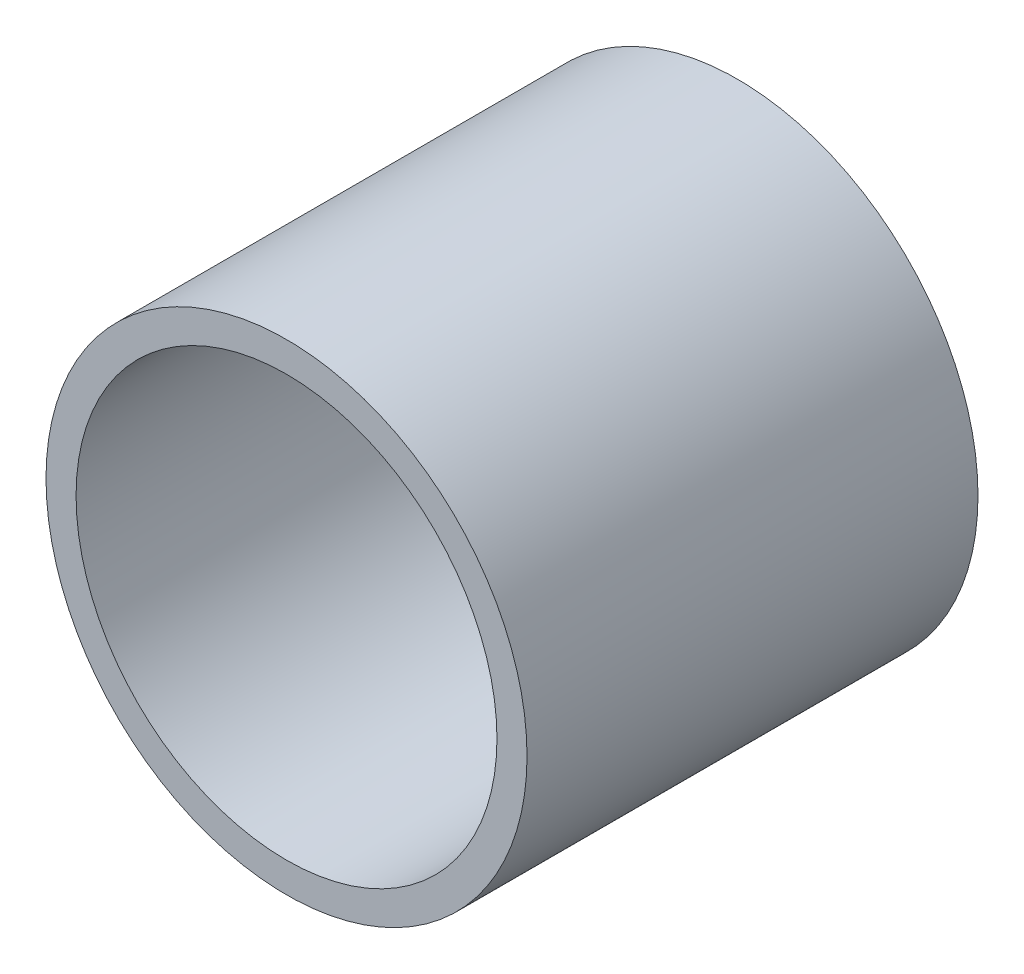
ISO-10303-21;
HEADER;
FILE_DESCRIPTION(('STEP AP214'),'2;1');
FILE_NAME('part.step','',(''),(''),'','','');
FILE_SCHEMA(('AUTOMOTIVE_DESIGN { 1 0 10303 214 1 1 1 1 }'));
ENDSEC;
DATA;
#1=APPLICATION_CONTEXT('core data for automotive mechanical design processes');
#2=APPLICATION_PROTOCOL_DEFINITION('international standard','automotive_design',2000,#1);
#3=PRODUCT_CONTEXT('',#1,'mechanical');
#4=PRODUCT('Part','Part','',(#3));
#5=PRODUCT_RELATED_PRODUCT_CATEGORY('part','',(#4));
#6=PRODUCT_DEFINITION_FORMATION('','',#4);
#7=PRODUCT_DEFINITION_CONTEXT('part definition',#1,'design');
#8=PRODUCT_DEFINITION('design','',#6,#7);
#9=PRODUCT_DEFINITION_SHAPE('','',#8);
#10=(LENGTH_UNIT() NAMED_UNIT(*) SI_UNIT(.MILLI.,.METRE.));
#11=(NAMED_UNIT(*) PLANE_ANGLE_UNIT() SI_UNIT($,.RADIAN.));
#12=(NAMED_UNIT(*) SI_UNIT($,.STERADIAN.) SOLID_ANGLE_UNIT());
#13=UNCERTAINTY_MEASURE_WITH_UNIT(LENGTH_MEASURE(1.E-05),#10,'distance_accuracy_value','');
#14=(GEOMETRIC_REPRESENTATION_CONTEXT(3) GLOBAL_UNCERTAINTY_ASSIGNED_CONTEXT((#13)) GLOBAL_UNIT_ASSIGNED_CONTEXT((#10,
#11,#12)) REPRESENTATION_CONTEXT('',''));
#15=CARTESIAN_POINT('',(0.,0.,0.));
#16=DIRECTION('',(0.,0.,1.));
#17=DIRECTION('',(1.,0.,0.));
#18=AXIS2_PLACEMENT_3D('',#15,#16,#17);
#19=CARTESIAN_POINT('',(0.,0.,45.));
#20=DIRECTION('',(0.,0.,1.));
#21=DIRECTION('',(1.,0.,0.));
#22=AXIS2_PLACEMENT_3D('',#19,#20,#21);
#23=PLANE('',#22);
#24=CARTESIAN_POINT('',(0.,0.,45.));
#25=DIRECTION('',(0.,0.,1.));
#26=DIRECTION('',(1.,0.,0.));
#27=AXIS2_PLACEMENT_3D('',#24,#25,#26);
#28=CIRCLE('',#27,24.);
#29=CARTESIAN_POINT('',(-24.,0.,45.));
#30=VERTEX_POINT('',#29);
#31=EDGE_CURVE('E10',#30,#30,#28,.T.);
#32=ORIENTED_EDGE('',*,*,#31,.T.);
#33=EDGE_LOOP('',(#32));
#34=FACE_BOUND('',#33,.T.);
#35=CARTESIAN_POINT('',(0.,0.,45.));
#36=DIRECTION('',(0.,0.,1.));
#37=DIRECTION('',(1.,0.,0.));
#38=AXIS2_PLACEMENT_3D('',#35,#36,#37);
#39=CIRCLE('',#38,21.);
#40=CARTESIAN_POINT('',(-21.,0.,45.));
#41=VERTEX_POINT('',#40);
#42=EDGE_CURVE('E41',#41,#41,#39,.T.);
#43=ORIENTED_EDGE('',*,*,#42,.F.);
#44=EDGE_LOOP('',(#43));
#45=FACE_BOUND('',#44,.T.);
#46=ADVANCED_FACE('F30',(#34,#45),#23,.T.);
#47=CARTESIAN_POINT('',(0.,0.,0.));
#48=DIRECTION('',(0.,0.,1.));
#49=DIRECTION('',(1.,0.,0.));
#50=AXIS2_PLACEMENT_3D('',#47,#48,#49);
#51=PLANE('',#50);
#52=CARTESIAN_POINT('',(0.,0.,0.));
#53=DIRECTION('',(0.,0.,1.));
#54=DIRECTION('',(1.,0.,0.));
#55=AXIS2_PLACEMENT_3D('',#52,#53,#54);
#56=CIRCLE('',#55,24.);
#57=CARTESIAN_POINT('',(-24.,0.,0.));
#58=VERTEX_POINT('',#57);
#59=EDGE_CURVE('E34',#58,#58,#56,.T.);
#60=ORIENTED_EDGE('',*,*,#59,.F.);
#61=EDGE_LOOP('',(#60));
#62=FACE_BOUND('',#61,.T.);
#63=CARTESIAN_POINT('',(0.,0.,0.));
#64=DIRECTION('',(0.,0.,1.));
#65=DIRECTION('',(1.,0.,0.));
#66=AXIS2_PLACEMENT_3D('',#63,#64,#65);
#67=CIRCLE('',#66,21.);
#68=CARTESIAN_POINT('',(-21.,0.,0.));
#69=VERTEX_POINT('',#68);
#70=EDGE_CURVE('E43',#69,#69,#67,.T.);
#71=ORIENTED_EDGE('',*,*,#70,.T.);
#72=EDGE_LOOP('',(#71));
#73=FACE_BOUND('',#72,.T.);
#74=ADVANCED_FACE('F53',(#62,#73),#51,.F.);
#75=CARTESIAN_POINT('',(0.,0.,45.));
#76=DIRECTION('',(0.,0.,-1.));
#77=DIRECTION('',(-1.,0.,0.));
#78=AXIS2_PLACEMENT_3D('',#75,#76,#77);
#79=CYLINDRICAL_SURFACE('',#78,24.);
#80=CARTESIAN_POINT('',(-24.,0.,45.));
#81=CARTESIAN_POINT('',(-24.,0.,44.53125));
#82=CARTESIAN_POINT('',(-24.,0.,44.0625));
#83=CARTESIAN_POINT('',(-24.,0.,43.125));
#84=CARTESIAN_POINT('',(-24.,0.,42.65625));
#85=CARTESIAN_POINT('',(-24.,0.,41.71875));
#86=CARTESIAN_POINT('',(-24.,0.,41.25));
#87=CARTESIAN_POINT('',(-24.,0.,40.3125));
#88=CARTESIAN_POINT('',(-24.,0.,39.84375));
#89=CARTESIAN_POINT('',(-24.,0.,38.90625));
#90=CARTESIAN_POINT('',(-24.,0.,38.4375));
#91=CARTESIAN_POINT('',(-24.,0.,37.5));
#92=CARTESIAN_POINT('',(-24.,0.,37.03125));
#93=CARTESIAN_POINT('',(-24.,0.,36.09375));
#94=CARTESIAN_POINT('',(-24.,0.,35.625));
#95=CARTESIAN_POINT('',(-24.,0.,34.6875));
#96=CARTESIAN_POINT('',(-24.,0.,34.21875));
#97=CARTESIAN_POINT('',(-24.,0.,33.28125));
#98=CARTESIAN_POINT('',(-24.,0.,32.8125));
#99=CARTESIAN_POINT('',(-24.,0.,31.875));
#100=CARTESIAN_POINT('',(-24.,0.,31.40625));
#101=CARTESIAN_POINT('',(-24.,0.,30.46875));
#102=CARTESIAN_POINT('',(-24.,0.,30.));
#103=CARTESIAN_POINT('',(-24.,0.,29.0625));
#104=CARTESIAN_POINT('',(-24.,0.,28.59375));
#105=CARTESIAN_POINT('',(-24.,0.,27.65625));
#106=CARTESIAN_POINT('',(-24.,0.,27.1875));
#107=CARTESIAN_POINT('',(-24.,0.,26.25));
#108=CARTESIAN_POINT('',(-24.,0.,25.78125));
#109=CARTESIAN_POINT('',(-24.,0.,24.84375));
#110=CARTESIAN_POINT('',(-24.,0.,24.375));
#111=CARTESIAN_POINT('',(-24.,0.,23.4375));
#112=CARTESIAN_POINT('',(-24.,0.,22.96875));
#113=CARTESIAN_POINT('',(-24.,0.,22.03125));
#114=CARTESIAN_POINT('',(-24.,0.,21.5625));
#115=CARTESIAN_POINT('',(-24.,0.,20.625));
#116=CARTESIAN_POINT('',(-24.,0.,20.15625));
#117=CARTESIAN_POINT('',(-24.,0.,19.21875));
#118=CARTESIAN_POINT('',(-24.,0.,18.75));
#119=CARTESIAN_POINT('',(-24.,0.,17.8125));
#120=CARTESIAN_POINT('',(-24.,0.,17.34375));
#121=CARTESIAN_POINT('',(-24.,0.,16.40625));
#122=CARTESIAN_POINT('',(-24.,0.,15.9375));
#123=CARTESIAN_POINT('',(-24.,0.,15.));
#124=CARTESIAN_POINT('',(-24.,0.,14.53125));
#125=CARTESIAN_POINT('',(-24.,0.,13.59375));
#126=CARTESIAN_POINT('',(-24.,0.,13.125));
#127=CARTESIAN_POINT('',(-24.,0.,12.1875));
#128=CARTESIAN_POINT('',(-24.,0.,11.71875));
#129=CARTESIAN_POINT('',(-24.,0.,10.78125));
#130=CARTESIAN_POINT('',(-24.,0.,10.3125));
#131=CARTESIAN_POINT('',(-24.,0.,9.37499999999999));
#132=CARTESIAN_POINT('',(-24.,0.,8.90624999999999));
#133=CARTESIAN_POINT('',(-24.,0.,7.96874999999999));
#134=CARTESIAN_POINT('',(-24.,0.,7.5));
#135=CARTESIAN_POINT('',(-24.,0.,6.56249999999999));
#136=CARTESIAN_POINT('',(-24.,0.,6.09374999999999));
#137=CARTESIAN_POINT('',(-24.,0.,5.15624999999999));
#138=CARTESIAN_POINT('',(-24.,0.,4.68749999999999));
#139=CARTESIAN_POINT('',(-24.,0.,3.74999999999999));
#140=CARTESIAN_POINT('',(-24.,0.,3.28124999999999));
#141=CARTESIAN_POINT('',(-24.,0.,2.34374999999999));
#142=CARTESIAN_POINT('',(-24.,0.,1.87499999999999));
#143=CARTESIAN_POINT('',(-24.,0.,0.937499999999992));
#144=CARTESIAN_POINT('',(-24.,0.,0.468749999999993));
#145=CARTESIAN_POINT('',(-24.,0.,0.));
#146=B_SPLINE_CURVE_WITH_KNOTS('',3,(#80,#81,#82,#83,#84,#85,#86,#87,#88,#89,#90,#91,#92,#93,
#94,#95,#96,#97,#98,#99,#100,#101,#102,#103,#104,#105,#106,#107,#108,#109,#110,#111,#112,#113,
#114,#115,#116,#117,#118,#119,#120,#121,#122,#123,#124,#125,#126,#127,#128,#129,#130,#131,#132,
#133,#134,#135,#136,#137,#138,#139,#140,#141,#142,#143,#144,#145),.UNSPECIFIED.,.F.,.F.,(4,2,2,
2,2,2,2,2,2,2,2,2,2,2,2,2,2,2,2,2,2,2,2,2,2,2,2,2,2,2,2,2,4),(0.,1.40625,2.8125,
4.21874999999999,5.625,7.03125,8.43749999999999,9.84375,11.25,12.65625,14.0625,15.46875,16.875,
18.28125,19.6875,21.09375,22.5,23.90625,25.3125,26.71875,28.125,29.53125,30.9375,32.34375,33.75,
35.15625,36.5625,37.96875,39.375,40.78125,42.1875,43.59375,45.),.UNSPECIFIED.);
#147=EDGE_CURVE('BSEAM32',#30,#58,#146,.T.);
#148=ORIENTED_EDGE('',*,*,#31,.F.);
#149=ORIENTED_EDGE('',*,*,#59,.T.);
#150=ORIENTED_EDGE('',*,*,#147,.T.);
#151=ORIENTED_EDGE('',*,*,#147,.F.);
#152=EDGE_LOOP('',(#148,#150,#149,#151));
#153=FACE_BOUND('',#152,.T.);
#154=ADVANCED_FACE('F32',(#153),#79,.T.);
#155=CARTESIAN_POINT('',(0.,0.,45.));
#156=DIRECTION('',(0.,0.,-1.));
#157=DIRECTION('',(-1.,0.,0.));
#158=AXIS2_PLACEMENT_3D('',#155,#156,#157);
#159=CYLINDRICAL_SURFACE('',#158,21.);
#160=CARTESIAN_POINT('',(-21.,0.,45.));
#161=CARTESIAN_POINT('',(-21.,0.,44.53125));
#162=CARTESIAN_POINT('',(-21.,0.,44.0625));
#163=CARTESIAN_POINT('',(-21.,0.,43.125));
#164=CARTESIAN_POINT('',(-21.,0.,42.65625));
#165=CARTESIAN_POINT('',(-21.,0.,41.71875));
#166=CARTESIAN_POINT('',(-21.,0.,41.25));
#167=CARTESIAN_POINT('',(-21.,0.,40.3125));
#168=CARTESIAN_POINT('',(-21.,0.,39.84375));
#169=CARTESIAN_POINT('',(-21.,0.,38.90625));
#170=CARTESIAN_POINT('',(-21.,0.,38.4375));
#171=CARTESIAN_POINT('',(-21.,0.,37.5));
#172=CARTESIAN_POINT('',(-21.,0.,37.03125));
#173=CARTESIAN_POINT('',(-21.,0.,36.09375));
#174=CARTESIAN_POINT('',(-21.,0.,35.625));
#175=CARTESIAN_POINT('',(-21.,0.,34.6875));
#176=CARTESIAN_POINT('',(-21.,0.,34.21875));
#177=CARTESIAN_POINT('',(-21.,0.,33.28125));
#178=CARTESIAN_POINT('',(-21.,0.,32.8125));
#179=CARTESIAN_POINT('',(-21.,0.,31.875));
#180=CARTESIAN_POINT('',(-21.,0.,31.40625));
#181=CARTESIAN_POINT('',(-21.,0.,30.46875));
#182=CARTESIAN_POINT('',(-21.,0.,30.));
#183=CARTESIAN_POINT('',(-21.,0.,29.0625));
#184=CARTESIAN_POINT('',(-21.,0.,28.59375));
#185=CARTESIAN_POINT('',(-21.,0.,27.65625));
#186=CARTESIAN_POINT('',(-21.,0.,27.1875));
#187=CARTESIAN_POINT('',(-21.,0.,26.25));
#188=CARTESIAN_POINT('',(-21.,0.,25.78125));
#189=CARTESIAN_POINT('',(-21.,0.,24.84375));
#190=CARTESIAN_POINT('',(-21.,0.,24.375));
#191=CARTESIAN_POINT('',(-21.,0.,23.4375));
#192=CARTESIAN_POINT('',(-21.,0.,22.96875));
#193=CARTESIAN_POINT('',(-21.,0.,22.03125));
#194=CARTESIAN_POINT('',(-21.,0.,21.5625));
#195=CARTESIAN_POINT('',(-21.,0.,20.625));
#196=CARTESIAN_POINT('',(-21.,0.,20.15625));
#197=CARTESIAN_POINT('',(-21.,0.,19.21875));
#198=CARTESIAN_POINT('',(-21.,0.,18.75));
#199=CARTESIAN_POINT('',(-21.,0.,17.8125));
#200=CARTESIAN_POINT('',(-21.,0.,17.34375));
#201=CARTESIAN_POINT('',(-21.,0.,16.40625));
#202=CARTESIAN_POINT('',(-21.,0.,15.9375));
#203=CARTESIAN_POINT('',(-21.,0.,15.));
#204=CARTESIAN_POINT('',(-21.,0.,14.53125));
#205=CARTESIAN_POINT('',(-21.,0.,13.59375));
#206=CARTESIAN_POINT('',(-21.,0.,13.125));
#207=CARTESIAN_POINT('',(-21.,0.,12.1875));
#208=CARTESIAN_POINT('',(-21.,0.,11.71875));
#209=CARTESIAN_POINT('',(-21.,0.,10.78125));
#210=CARTESIAN_POINT('',(-21.,0.,10.3125));
#211=CARTESIAN_POINT('',(-21.,0.,9.375));
#212=CARTESIAN_POINT('',(-21.,0.,8.90625));
#213=CARTESIAN_POINT('',(-21.,0.,7.96874999999999));
#214=CARTESIAN_POINT('',(-21.,0.,7.5));
#215=CARTESIAN_POINT('',(-21.,0.,6.5625));
#216=CARTESIAN_POINT('',(-21.,0.,6.09375));
#217=CARTESIAN_POINT('',(-21.,0.,5.15625));
#218=CARTESIAN_POINT('',(-21.,0.,4.68749999999999));
#219=CARTESIAN_POINT('',(-21.,0.,3.74999999999999));
#220=CARTESIAN_POINT('',(-21.,0.,3.28124999999999));
#221=CARTESIAN_POINT('',(-21.,0.,2.34374999999999));
#222=CARTESIAN_POINT('',(-21.,0.,1.87499999999999));
#223=CARTESIAN_POINT('',(-21.,0.,0.937499999999992));
#224=CARTESIAN_POINT('',(-21.,0.,0.468749999999993));
#225=CARTESIAN_POINT('',(-21.,0.,0.));
#226=B_SPLINE_CURVE_WITH_KNOTS('',3,(#160,#161,#162,#163,#164,#165,#166,#167,#168,#169,#170,
#171,#172,#173,#174,#175,#176,#177,#178,#179,#180,#181,#182,#183,#184,#185,#186,#187,#188,#189,
#190,#191,#192,#193,#194,#195,#196,#197,#198,#199,#200,#201,#202,#203,#204,#205,#206,#207,#208,
#209,#210,#211,#212,#213,#214,#215,#216,#217,#218,#219,#220,#221,#222,#223,#224,#225),
.UNSPECIFIED.,.F.,.F.,(4,2,2,2,2,2,2,2,2,2,2,2,2,2,2,2,2,2,2,2,2,2,2,2,2,2,2,2,2,2,2,2,4),(0.,
1.40625,2.8125,4.21875000000001,5.62500000000001,7.03125,8.4375,9.84375000000001,11.25,12.65625,
14.0625,15.46875,16.875,18.28125,19.6875,21.09375,22.5,23.90625,25.3125,26.71875,28.125,
29.53125,30.9375,32.34375,33.75,35.15625,36.5625,37.96875,39.375,40.78125,42.1875,43.59375,45.),.UNSPECIFIED.);
#227=EDGE_CURVE('BSEAM49',#41,#69,#226,.T.);
#228=ORIENTED_EDGE('',*,*,#42,.T.);
#229=ORIENTED_EDGE('',*,*,#70,.F.);
#230=ORIENTED_EDGE('',*,*,#227,.T.);
#231=ORIENTED_EDGE('',*,*,#227,.F.);
#232=EDGE_LOOP('',(#228,#230,#229,#231));
#233=FACE_BOUND('',#232,.T.);
#234=ADVANCED_FACE('F49',(#233),#159,.F.);
#235=CLOSED_SHELL('',(#46,#74,#154,#234));
#236=MANIFOLD_SOLID_BREP('B2',#235);
#237=ADVANCED_BREP_SHAPE_REPRESENTATION('',(#18,#236),#14);
#238=SHAPE_DEFINITION_REPRESENTATION(#9,#237);
ENDSEC;
END-ISO-10303-21;
